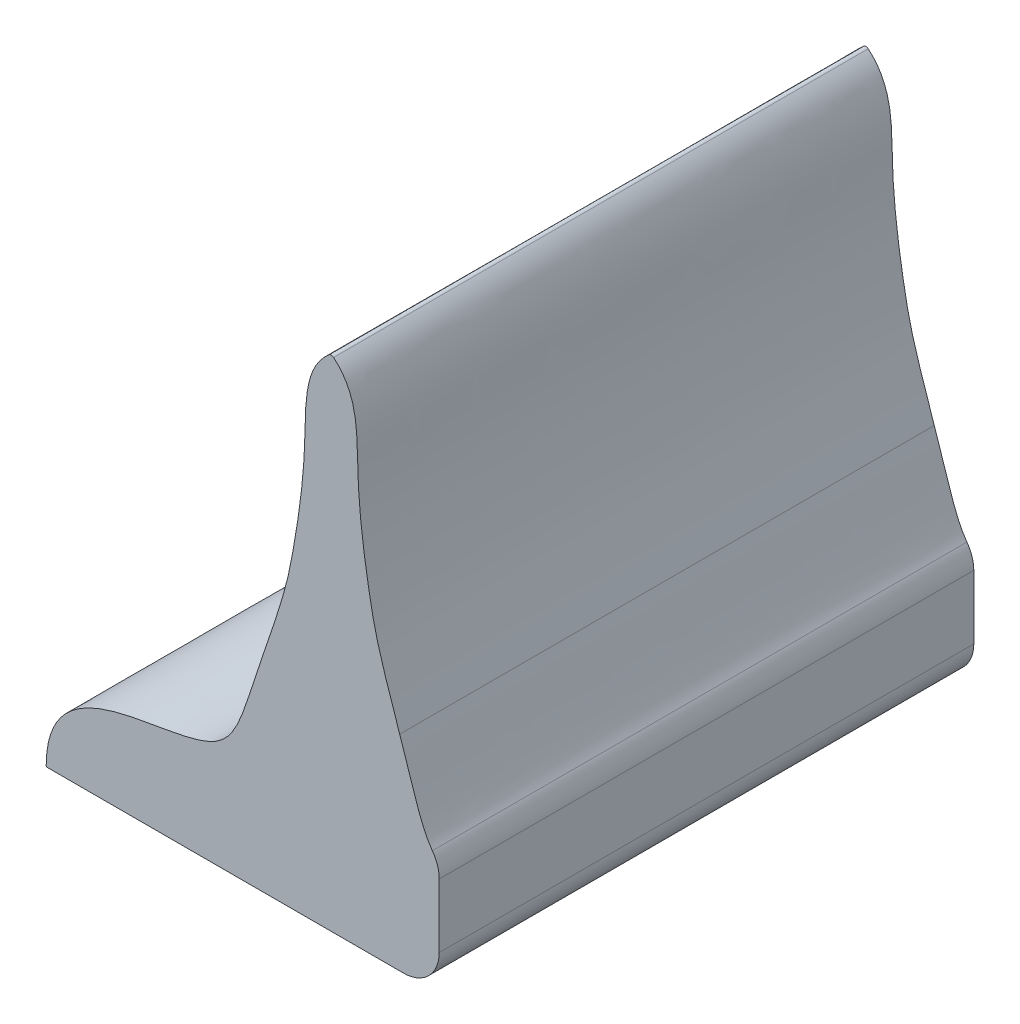
ISO-10303-21;
HEADER;
FILE_DESCRIPTION(('STEP AP214'),'2;1');
FILE_NAME('part.step','',(''),(''),'','','');
FILE_SCHEMA(('AUTOMOTIVE_DESIGN { 1 0 10303 214 1 1 1 1 }'));
ENDSEC;
DATA;
#1=APPLICATION_CONTEXT('core data for automotive mechanical design processes');
#2=APPLICATION_PROTOCOL_DEFINITION('international standard','automotive_design',2000,#1);
#3=PRODUCT_CONTEXT('',#1,'mechanical');
#4=PRODUCT('Part','Part','',(#3));
#5=PRODUCT_RELATED_PRODUCT_CATEGORY('part','',(#4));
#6=PRODUCT_DEFINITION_FORMATION('','',#4);
#7=PRODUCT_DEFINITION_CONTEXT('part definition',#1,'design');
#8=PRODUCT_DEFINITION('design','',#6,#7);
#9=PRODUCT_DEFINITION_SHAPE('','',#8);
#10=(LENGTH_UNIT() NAMED_UNIT(*) SI_UNIT(.MILLI.,.METRE.));
#11=(NAMED_UNIT(*) PLANE_ANGLE_UNIT() SI_UNIT($,.RADIAN.));
#12=(NAMED_UNIT(*) SI_UNIT($,.STERADIAN.) SOLID_ANGLE_UNIT());
#13=UNCERTAINTY_MEASURE_WITH_UNIT(LENGTH_MEASURE(1.E-05),#10,'distance_accuracy_value','');
#14=(GEOMETRIC_REPRESENTATION_CONTEXT(3) GLOBAL_UNCERTAINTY_ASSIGNED_CONTEXT((#13)) GLOBAL_UNIT_ASSIGNED_CONTEXT((#10,
#11,#12)) REPRESENTATION_CONTEXT('',''));
#15=CARTESIAN_POINT('',(0.,0.,0.));
#16=DIRECTION('',(0.,0.,1.));
#17=DIRECTION('',(1.,0.,0.));
#18=AXIS2_PLACEMENT_3D('',#15,#16,#17);
#19=CARTESIAN_POINT('',(-3.83928792305532,11.5062229319923,30.));
#20=CARTESIAN_POINT('',(-4.9390578203306,8.31834192010126,30.));
#21=CARTESIAN_POINT('',(-5.60973107041494,3.7741305134855,30.));
#22=CARTESIAN_POINT('',(-16.0152876226829,5.72533176530899,30.));
#23=CARTESIAN_POINT('',(-16.,0.,30.));
#24=B_SPLINE_CURVE_WITH_KNOTS('',3,(#19,#20,#21,#22,#23),.UNSPECIFIED.,.F.,.F.,(4,1,4),(0.,
0.346447494096365,1.),.UNSPECIFIED.);
#25=DIRECTION('',(0.,0.,-1.));
#26=VECTOR('',#25,1.);
#27=SURFACE_OF_LINEAR_EXTRUSION('',#24,#26);
#28=CARTESIAN_POINT('',(-3.83928792305532,11.5062229319923,0.));
#29=CARTESIAN_POINT('',(-4.9390578203306,8.31834192010126,0.));
#30=CARTESIAN_POINT('',(-5.60973107041494,3.7741305134855,0.));
#31=CARTESIAN_POINT('',(-16.0152876226829,5.72533176530899,0.));
#32=CARTESIAN_POINT('',(-16.,0.,0.));
#33=B_SPLINE_CURVE_WITH_KNOTS('',3,(#28,#29,#30,#31,#32),.UNSPECIFIED.,.F.,.F.,(4,1,4),(0.,
0.346447494096365,1.),.UNSPECIFIED.);
#34=CARTESIAN_POINT('',(-3.83928792305532,11.5062229319923,0.));
#35=VERTEX_POINT('',#34);
#36=CARTESIAN_POINT('',(-15.9999588069866,0.0502165188992139,0.));
#37=VERTEX_POINT('',#36);
#38=EDGE_CURVE('E256',#35,#37,#33,.T.);
#39=ORIENTED_EDGE('',*,*,#38,.T.);
#40=DIRECTION('',(0.,0.,-1.));
#41=VECTOR('',#40,1.);
#42=CARTESIAN_POINT('',(-15.9999588069866,0.0502165188992139,0.));
#43=LINE('',#42,#41);
#44=CARTESIAN_POINT('',(-15.9999588069866,0.0502165188992139,30.));
#45=VERTEX_POINT('',#44);
#46=EDGE_CURVE('E48',#37,#45,#43,.F.);
#47=ORIENTED_EDGE('',*,*,#46,.T.);
#48=CARTESIAN_POINT('',(-3.83928792305532,11.5062229319923,30.));
#49=VERTEX_POINT('',#48);
#50=EDGE_CURVE('E183',#49,#45,#24,.T.);
#51=ORIENTED_EDGE('',*,*,#50,.F.);
#52=DIRECTION('',(0.,0.,-1.));
#53=VECTOR('',#52,1.);
#54=CARTESIAN_POINT('',(-3.83928792305532,11.5062229319923,30.));
#55=LINE('',#54,#53);
#56=EDGE_CURVE('E142',#49,#35,#55,.T.);
#57=ORIENTED_EDGE('',*,*,#56,.T.);
#58=EDGE_LOOP('',(#39,#47,#51,#57));
#59=FACE_BOUND('',#58,.T.);
#60=ADVANCED_FACE('F39',(#59),#27,.F.);
#61=CARTESIAN_POINT('',(-16.,0.,30.));
#62=DIRECTION('',(0.,1.,0.));
#63=DIRECTION('',(0.,0.,1.));
#64=AXIS2_PLACEMENT_3D('',#61,#62,#63);
#65=PLANE('',#64);
#66=DIRECTION('',(1.,0.,0.));
#67=VECTOR('',#66,1.);
#68=CARTESIAN_POINT('',(-16.,0.,30.));
#69=LINE('',#68,#67);
#70=CARTESIAN_POINT('',(-15.9499592757932,0.,30.));
#71=VERTEX_POINT('',#70);
#72=CARTESIAN_POINT('',(4.0556273169077,0.,30.));
#73=VERTEX_POINT('',#72);
#74=EDGE_CURVE('E130',#71,#73,#69,.T.);
#75=ORIENTED_EDGE('',*,*,#74,.F.);
#76=DIRECTION('',(0.,0.,-1.));
#77=VECTOR('',#76,1.);
#78=CARTESIAN_POINT('',(-15.9499592757932,0.,30.));
#79=LINE('',#78,#77);
#80=CARTESIAN_POINT('',(-15.9499592757932,0.,0.));
#81=VERTEX_POINT('',#80);
#82=EDGE_CURVE('E247',#71,#81,#79,.T.);
#83=ORIENTED_EDGE('',*,*,#82,.T.);
#84=DIRECTION('',(1.,0.,0.));
#85=VECTOR('',#84,1.);
#86=CARTESIAN_POINT('',(-16.,0.,0.));
#87=LINE('',#86,#85);
#88=CARTESIAN_POINT('',(4.0556273169077,0.,0.));
#89=VERTEX_POINT('',#88);
#90=EDGE_CURVE('E212',#81,#89,#87,.T.);
#91=ORIENTED_EDGE('',*,*,#90,.T.);
#92=DIRECTION('',(0.,0.,1.));
#93=VECTOR('',#92,1.);
#94=CARTESIAN_POINT('',(4.0556273169077,0.,30.));
#95=LINE('',#94,#93);
#96=EDGE_CURVE('E207',#89,#73,#95,.T.);
#97=ORIENTED_EDGE('',*,*,#96,.T.);
#98=EDGE_LOOP('',(#75,#83,#91,#97));
#99=FACE_BOUND('',#98,.T.);
#100=ADVANCED_FACE('F174',(#99),#65,.F.);
#101=CARTESIAN_POINT('',(16.,0.,30.));
#102=CARTESIAN_POINT('',(16.0152876226829,5.72533176530899,30.));
#103=CARTESIAN_POINT('',(5.60973107041494,3.7741305134855,30.));
#104=CARTESIAN_POINT('',(4.9390578203306,8.31834192010126,30.));
#105=CARTESIAN_POINT('',(3.83928792305532,11.5062229319923,30.));
#106=B_SPLINE_CURVE_WITH_KNOTS('',3,(#101,#102,#103,#104,#105),.UNSPECIFIED.,.F.,.F.,(4,1,4),
(0.,0.653552505903635,1.),.UNSPECIFIED.);
#107=DIRECTION('',(0.,0.,-1.));
#108=VECTOR('',#107,1.);
#109=SURFACE_OF_LINEAR_EXTRUSION('',#106,#108);
#110=CARTESIAN_POINT('',(5.66946446828319,6.7572796380857,30.));
#111=VERTEX_POINT('',#110);
#112=CARTESIAN_POINT('',(3.83928792305532,11.5062229319923,30.));
#113=VERTEX_POINT('',#112);
#114=EDGE_CURVE('E117',#111,#113,#106,.T.);
#115=ORIENTED_EDGE('',*,*,#114,.F.);
#116=DIRECTION('',(0.,0.,-1.));
#117=VECTOR('',#116,1.);
#118=CARTESIAN_POINT('',(5.6694644682832,6.75727963808569,30.));
#119=LINE('',#118,#117);
#120=CARTESIAN_POINT('',(5.6694644682832,6.75727963808569,0.));
#121=VERTEX_POINT('',#120);
#122=EDGE_CURVE('E232',#111,#121,#119,.T.);
#123=ORIENTED_EDGE('',*,*,#122,.T.);
#124=CARTESIAN_POINT('',(16.,0.,0.));
#125=CARTESIAN_POINT('',(16.0152876226829,5.72533176530899,0.));
#126=CARTESIAN_POINT('',(5.60973107041494,3.7741305134855,0.));
#127=CARTESIAN_POINT('',(4.9390578203306,8.31834192010126,0.));
#128=CARTESIAN_POINT('',(3.83928792305532,11.5062229319923,0.));
#129=B_SPLINE_CURVE_WITH_KNOTS('',3,(#124,#125,#126,#127,#128),.UNSPECIFIED.,.F.,.F.,(4,1,4),
(0.,0.653552505903635,1.),.UNSPECIFIED.);
#130=CARTESIAN_POINT('',(3.83928792305532,11.5062229319923,0.));
#131=VERTEX_POINT('',#130);
#132=EDGE_CURVE('E136',#121,#131,#129,.T.);
#133=ORIENTED_EDGE('',*,*,#132,.T.);
#134=DIRECTION('',(0.,0.,-1.));
#135=VECTOR('',#134,1.);
#136=CARTESIAN_POINT('',(3.83928792305532,11.5062229319923,30.));
#137=LINE('',#136,#135);
#138=EDGE_CURVE('E133',#113,#131,#137,.T.);
#139=ORIENTED_EDGE('',*,*,#138,.F.);
#140=EDGE_LOOP('',(#115,#123,#133,#139));
#141=FACE_BOUND('',#140,.T.);
#142=ADVANCED_FACE('F134',(#141),#109,.F.);
#143=CARTESIAN_POINT('',(3.83928792305532,11.5062229319923,30.));
#144=CARTESIAN_POINT('',(2.66154697558014,14.9201170681063,30.));
#145=CARTESIAN_POINT('',(2.26787353956355,16.5078709063229,30.));
#146=CARTESIAN_POINT('',(1.2442344881811,22.8904252198087,30.));
#147=CARTESIAN_POINT('',(1.60031555707163,26.8356859673307,30.));
#148=CARTESIAN_POINT('',(0.,28.0648049786921,30.));
#149=B_SPLINE_CURVE_WITH_KNOTS('',3,(#143,#144,#145,#146,#147,#148),.UNSPECIFIED.,.F.,.F.,(4,1,
1,4),(0.,0.351320855241713,0.674109807468444,1.),.UNSPECIFIED.);
#150=DIRECTION('',(0.,0.,-1.));
#151=VECTOR('',#150,1.);
#152=SURFACE_OF_LINEAR_EXTRUSION('',#149,#151);
#153=CARTESIAN_POINT('',(3.83928792305532,11.5062229319923,0.));
#154=CARTESIAN_POINT('',(2.66154697558014,14.9201170681063,0.));
#155=CARTESIAN_POINT('',(2.26787353956355,16.5078709063229,0.));
#156=CARTESIAN_POINT('',(1.2442344881811,22.8904252198087,0.));
#157=CARTESIAN_POINT('',(1.60031555707163,26.8356859673307,0.));
#158=CARTESIAN_POINT('',(0.,28.0648049786921,0.));
#159=B_SPLINE_CURVE_WITH_KNOTS('',3,(#153,#154,#155,#156,#157,#158),.UNSPECIFIED.,.F.,.F.,(4,1,
1,4),(0.,0.351320855241713,0.674109807468444,1.),.UNSPECIFIED.);
#160=CARTESIAN_POINT('',(0.129094643862903,27.9608112242923,0.));
#161=VERTEX_POINT('',#160);
#162=EDGE_CURVE('E260',#131,#161,#159,.T.);
#163=ORIENTED_EDGE('',*,*,#162,.T.);
#164=DIRECTION('',(0.,0.,-1.));
#165=VECTOR('',#164,1.);
#166=CARTESIAN_POINT('',(0.129094643873311,27.9608112242835,0.));
#167=LINE('',#166,#165);
#168=CARTESIAN_POINT('',(0.129094643862903,27.9608112242923,30.));
#169=VERTEX_POINT('',#168);
#170=EDGE_CURVE('E146',#161,#169,#167,.F.);
#171=ORIENTED_EDGE('',*,*,#170,.T.);
#172=EDGE_CURVE('E121',#113,#169,#149,.T.);
#173=ORIENTED_EDGE('',*,*,#172,.F.);
#174=ORIENTED_EDGE('',*,*,#138,.T.);
#175=EDGE_LOOP('',(#163,#171,#173,#174));
#176=FACE_BOUND('',#175,.T.);
#177=ADVANCED_FACE('F144',(#176),#152,.F.);
#178=CARTESIAN_POINT('',(0.,28.0648049786921,30.));
#179=CARTESIAN_POINT('',(-1.60031555707163,26.8356859673307,30.));
#180=CARTESIAN_POINT('',(-1.2442344881811,22.8904252198086,30.));
#181=CARTESIAN_POINT('',(-2.26787353956355,16.5078709063229,30.));
#182=CARTESIAN_POINT('',(-2.66154697558014,14.9201170681063,30.));
#183=CARTESIAN_POINT('',(-3.83928792305532,11.5062229319923,30.));
#184=B_SPLINE_CURVE_WITH_KNOTS('',3,(#178,#179,#180,#181,#182,#183),.UNSPECIFIED.,.F.,.F.,(4,1,
1,4),(0.,0.325890192531556,0.648679144758287,1.),.UNSPECIFIED.);
#185=DIRECTION('',(0.,0.,-1.));
#186=VECTOR('',#185,1.);
#187=SURFACE_OF_LINEAR_EXTRUSION('',#184,#186);
#188=CARTESIAN_POINT('',(-0.129094643862899,27.9608112242923,30.));
#189=VERTEX_POINT('',#188);
#190=EDGE_CURVE('E148',#189,#49,#184,.T.);
#191=ORIENTED_EDGE('',*,*,#190,.F.);
#192=DIRECTION('',(0.,0.,-1.));
#193=VECTOR('',#192,1.);
#194=CARTESIAN_POINT('',(-0.129094643873308,27.9608112242835,30.));
#195=LINE('',#194,#193);
#196=CARTESIAN_POINT('',(-0.129094643862899,27.9608112242923,0.));
#197=VERTEX_POINT('',#196);
#198=EDGE_CURVE('E235',#189,#197,#195,.T.);
#199=ORIENTED_EDGE('',*,*,#198,.T.);
#200=CARTESIAN_POINT('',(0.,28.0648049786921,0.));
#201=CARTESIAN_POINT('',(-1.60031555707163,26.8356859673307,0.));
#202=CARTESIAN_POINT('',(-1.2442344881811,22.8904252198086,0.));
#203=CARTESIAN_POINT('',(-2.26787353956355,16.5078709063229,0.));
#204=CARTESIAN_POINT('',(-2.66154697558014,14.9201170681063,0.));
#205=CARTESIAN_POINT('',(-3.83928792305532,11.5062229319923,0.));
#206=B_SPLINE_CURVE_WITH_KNOTS('',3,(#200,#201,#202,#203,#204,#205),.UNSPECIFIED.,.F.,.F.,(4,1,
1,4),(0.,0.325890192531556,0.648679144758287,1.),.UNSPECIFIED.);
#207=EDGE_CURVE('E189',#197,#35,#206,.T.);
#208=ORIENTED_EDGE('',*,*,#207,.T.);
#209=ORIENTED_EDGE('',*,*,#56,.F.);
#210=EDGE_LOOP('',(#191,#199,#208,#209));
#211=FACE_BOUND('',#210,.T.);
#212=ADVANCED_FACE('F170',(#211),#187,.F.);
#213=CARTESIAN_POINT('',(-8.98104759586111,5.22527554157456,30.));
#214=DIRECTION('',(0.,0.,-1.));
#215=DIRECTION('',(-1.,0.,0.));
#216=AXIS2_PLACEMENT_3D('',#213,#214,#215);
#217=PLANE('',#216);
#218=ORIENTED_EDGE('',*,*,#50,.T.);
#219=CARTESIAN_POINT('',(-15.9499592757932,0.0499999999994962,30.));
#220=DIRECTION('',(0.,0.,-1.));
#221=DIRECTION('',(-1.,0.,0.));
#222=AXIS2_PLACEMENT_3D('',#219,#220,#221);
#223=CIRCLE('',#222,0.05);
#224=EDGE_CURVE('E11',#45,#71,#223,.F.);
#225=ORIENTED_EDGE('',*,*,#224,.T.);
#226=ORIENTED_EDGE('',*,*,#74,.T.);
#227=CARTESIAN_POINT('',(4.0556273169077,2.,30.));
#228=DIRECTION('',(0.,0.,-1.));
#229=DIRECTION('',(-1.,0.,0.));
#230=AXIS2_PLACEMENT_3D('',#227,#228,#229);
#231=CIRCLE('',#230,2.);
#232=CARTESIAN_POINT('',(6.0556273169077,2.,30.));
#233=VERTEX_POINT('',#232);
#234=EDGE_CURVE('E197',#73,#233,#231,.F.);
#235=ORIENTED_EDGE('',*,*,#234,.T.);
#236=DIRECTION('',(0.,-1.,0.));
#237=VECTOR('',#236,1.);
#238=CARTESIAN_POINT('',(6.0556273169077,14.5137186784584,30.));
#239=LINE('',#238,#237);
#240=CARTESIAN_POINT('',(6.0556273169077,5.57595426002924,30.));
#241=VERTEX_POINT('',#240);
#242=EDGE_CURVE('E190',#241,#233,#239,.T.);
#243=ORIENTED_EDGE('',*,*,#242,.F.);
#244=CARTESIAN_POINT('',(4.0556273169077,5.57595426002924,30.));
#245=DIRECTION('',(0.,0.,-1.));
#246=DIRECTION('',(-1.,0.,0.));
#247=AXIS2_PLACEMENT_3D('',#244,#245,#246);
#248=CIRCLE('',#247,2.);
#249=EDGE_CURVE('E125',#241,#111,#248,.F.);
#250=ORIENTED_EDGE('',*,*,#249,.T.);
#251=ORIENTED_EDGE('',*,*,#114,.T.);
#252=ORIENTED_EDGE('',*,*,#172,.T.);
#253=CARTESIAN_POINT('',(0.,27.8080546436618,30.));
#254=DIRECTION('',(0.,0.,-1.));
#255=DIRECTION('',(-1.,0.,0.));
#256=AXIS2_PLACEMENT_3D('',#253,#254,#255);
#257=CIRCLE('',#256,0.2);
#258=EDGE_CURVE('E244',#169,#189,#257,.F.);
#259=ORIENTED_EDGE('',*,*,#258,.T.);
#260=ORIENTED_EDGE('',*,*,#190,.T.);
#261=EDGE_LOOP('',(#218,#225,#226,#235,#243,#250,#251,#252,#259,#260));
#262=FACE_BOUND('',#261,.T.);
#263=ADVANCED_FACE('F119',(#262),#217,.F.);
#264=CARTESIAN_POINT('',(-8.98104759586111,5.22527554157456,0.));
#265=DIRECTION('',(0.,0.,-1.));
#266=DIRECTION('',(-1.,0.,0.));
#267=AXIS2_PLACEMENT_3D('',#264,#265,#266);
#268=PLANE('',#267);
#269=ORIENTED_EDGE('',*,*,#90,.F.);
#270=CARTESIAN_POINT('',(-15.9499592757932,0.0499999999994962,0.));
#271=DIRECTION('',(0.,0.,-1.));
#272=DIRECTION('',(-1.,0.,0.));
#273=AXIS2_PLACEMENT_3D('',#270,#271,#272);
#274=CIRCLE('',#273,0.05);
#275=EDGE_CURVE('E62',#81,#37,#274,.T.);
#276=ORIENTED_EDGE('',*,*,#275,.T.);
#277=ORIENTED_EDGE('',*,*,#38,.F.);
#278=ORIENTED_EDGE('',*,*,#207,.F.);
#279=CARTESIAN_POINT('',(0.,27.8080546436618,0.));
#280=DIRECTION('',(0.,0.,-1.));
#281=DIRECTION('',(-1.,0.,0.));
#282=AXIS2_PLACEMENT_3D('',#279,#280,#281);
#283=CIRCLE('',#282,0.2);
#284=EDGE_CURVE('E239',#197,#161,#283,.T.);
#285=ORIENTED_EDGE('',*,*,#284,.T.);
#286=ORIENTED_EDGE('',*,*,#162,.F.);
#287=ORIENTED_EDGE('',*,*,#132,.F.);
#288=CARTESIAN_POINT('',(4.0556273169077,5.57595426002924,0.));
#289=DIRECTION('',(0.,0.,-1.));
#290=DIRECTION('',(-1.,0.,0.));
#291=AXIS2_PLACEMENT_3D('',#288,#289,#290);
#292=CIRCLE('',#291,2.);
#293=CARTESIAN_POINT('',(6.0556273169077,5.57595426002924,0.));
#294=VERTEX_POINT('',#293);
#295=EDGE_CURVE('E226',#121,#294,#292,.T.);
#296=ORIENTED_EDGE('',*,*,#295,.T.);
#297=DIRECTION('',(0.,1.,0.));
#298=VECTOR('',#297,1.);
#299=CARTESIAN_POINT('',(6.0556273169077,5.22527554157456,0.));
#300=LINE('',#299,#298);
#301=CARTESIAN_POINT('',(6.0556273169077,2.,0.));
#302=VERTEX_POINT('',#301);
#303=EDGE_CURVE('E141',#302,#294,#300,.T.);
#304=ORIENTED_EDGE('',*,*,#303,.F.);
#305=CARTESIAN_POINT('',(4.0556273169077,2.,0.));
#306=DIRECTION('',(0.,0.,-1.));
#307=DIRECTION('',(-1.,0.,0.));
#308=AXIS2_PLACEMENT_3D('',#305,#306,#307);
#309=CIRCLE('',#308,2.);
#310=EDGE_CURVE('E229',#302,#89,#309,.T.);
#311=ORIENTED_EDGE('',*,*,#310,.T.);
#312=EDGE_LOOP('',(#269,#276,#277,#278,#285,#286,#287,#296,#304,#311));
#313=FACE_BOUND('',#312,.T.);
#314=ADVANCED_FACE('F253',(#313),#268,.T.);
#315=CARTESIAN_POINT('',(6.0556273169077,14.5137186784584,0.));
#316=DIRECTION('',(-1.,0.,0.));
#317=DIRECTION('',(0.,-1.,0.));
#318=AXIS2_PLACEMENT_3D('',#315,#316,#317);
#319=PLANE('',#318);
#320=ORIENTED_EDGE('',*,*,#242,.T.);
#321=DIRECTION('',(0.,0.,1.));
#322=VECTOR('',#321,1.);
#323=CARTESIAN_POINT('',(6.0556273169077,2.,0.));
#324=LINE('',#323,#322);
#325=EDGE_CURVE('E208',#233,#302,#324,.F.);
#326=ORIENTED_EDGE('',*,*,#325,.T.);
#327=ORIENTED_EDGE('',*,*,#303,.T.);
#328=DIRECTION('',(0.,0.,-1.));
#329=VECTOR('',#328,1.);
#330=CARTESIAN_POINT('',(6.0556273169077,5.57595426002924,0.));
#331=LINE('',#330,#329);
#332=EDGE_CURVE('E210',#294,#241,#331,.F.);
#333=ORIENTED_EDGE('',*,*,#332,.T.);
#334=EDGE_LOOP('',(#320,#326,#327,#333));
#335=FACE_BOUND('',#334,.T.);
#336=ADVANCED_FACE('F305',(#335),#319,.F.);
#337=CARTESIAN_POINT('',(4.0556273169077,2.,30.));
#338=DIRECTION('',(0.,0.,1.));
#339=DIRECTION('',(1.,0.,0.));
#340=AXIS2_PLACEMENT_3D('',#337,#338,#339);
#341=CYLINDRICAL_SURFACE('',#340,2.);
#342=ORIENTED_EDGE('',*,*,#310,.F.);
#343=ORIENTED_EDGE('',*,*,#325,.F.);
#344=ORIENTED_EDGE('',*,*,#234,.F.);
#345=ORIENTED_EDGE('',*,*,#96,.F.);
#346=EDGE_LOOP('',(#342,#343,#344,#345));
#347=FACE_BOUND('',#346,.T.);
#348=ADVANCED_FACE('F181',(#347),#341,.T.);
#349=CARTESIAN_POINT('',(4.0556273169077,5.57595426002924,15.));
#350=DIRECTION('',(0.,0.,-1.));
#351=DIRECTION('',(-1.,0.,0.));
#352=AXIS2_PLACEMENT_3D('',#349,#350,#351);
#353=CYLINDRICAL_SURFACE('',#352,2.);
#354=ORIENTED_EDGE('',*,*,#249,.F.);
#355=ORIENTED_EDGE('',*,*,#332,.F.);
#356=ORIENTED_EDGE('',*,*,#295,.F.);
#357=ORIENTED_EDGE('',*,*,#122,.F.);
#358=EDGE_LOOP('',(#354,#355,#356,#357));
#359=FACE_BOUND('',#358,.T.);
#360=ADVANCED_FACE('F297',(#359),#353,.T.);
#361=CARTESIAN_POINT('',(0.,27.8080546436618,15.));
#362=DIRECTION('',(0.,0.,-1.));
#363=DIRECTION('',(-1.,0.,0.));
#364=AXIS2_PLACEMENT_3D('',#361,#362,#363);
#365=CYLINDRICAL_SURFACE('',#364,0.2);
#366=ORIENTED_EDGE('',*,*,#258,.F.);
#367=ORIENTED_EDGE('',*,*,#170,.F.);
#368=ORIENTED_EDGE('',*,*,#284,.F.);
#369=ORIENTED_EDGE('',*,*,#198,.F.);
#370=EDGE_LOOP('',(#366,#367,#368,#369));
#371=FACE_BOUND('',#370,.T.);
#372=ADVANCED_FACE('F292',(#371),#365,.T.);
#373=CARTESIAN_POINT('',(-15.9499592757932,0.0499999999994962,15.));
#374=DIRECTION('',(0.,0.,-1.));
#375=DIRECTION('',(-1.,0.,0.));
#376=AXIS2_PLACEMENT_3D('',#373,#374,#375);
#377=CYLINDRICAL_SURFACE('',#376,0.05);
#378=ORIENTED_EDGE('',*,*,#224,.F.);
#379=ORIENTED_EDGE('',*,*,#46,.F.);
#380=ORIENTED_EDGE('',*,*,#275,.F.);
#381=ORIENTED_EDGE('',*,*,#82,.F.);
#382=EDGE_LOOP('',(#378,#379,#380,#381));
#383=FACE_BOUND('',#382,.T.);
#384=ADVANCED_FACE('F41',(#383),#377,.T.);
#385=CLOSED_SHELL('',(#60,#100,#142,#177,#212,#263,#314,#336,#348,#360,#372,#384));
#386=MANIFOLD_SOLID_BREP('B2',#385);
#387=ADVANCED_BREP_SHAPE_REPRESENTATION('',(#18,#386),#14);
#388=SHAPE_DEFINITION_REPRESENTATION(#9,#387);
ENDSEC;
END-ISO-10303-21;
